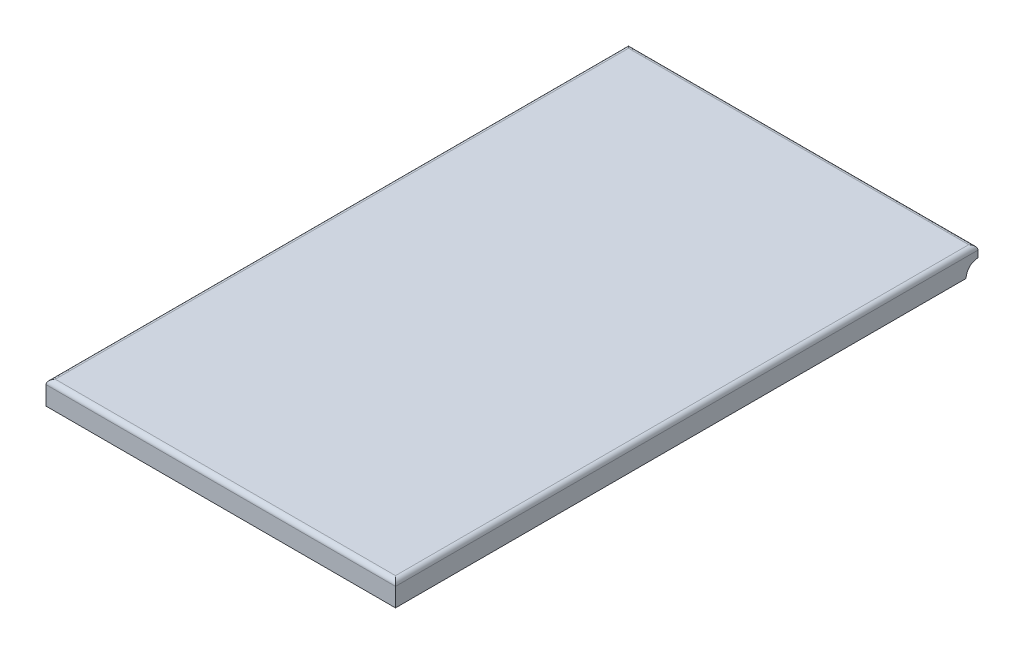
ISO-10303-21;
HEADER;
FILE_DESCRIPTION(('STEP AP214'),'2;1');
FILE_NAME('part.step','',(''),(''),'','','');
FILE_SCHEMA(('AUTOMOTIVE_DESIGN { 1 0 10303 214 1 1 1 1 }'));
ENDSEC;
DATA;
#1=APPLICATION_CONTEXT('core data for automotive mechanical design processes');
#2=APPLICATION_PROTOCOL_DEFINITION('international standard','automotive_design',2000,#1);
#3=PRODUCT_CONTEXT('',#1,'mechanical');
#4=PRODUCT('Part','Part','',(#3));
#5=PRODUCT_RELATED_PRODUCT_CATEGORY('part','',(#4));
#6=PRODUCT_DEFINITION_FORMATION('','',#4);
#7=PRODUCT_DEFINITION_CONTEXT('part definition',#1,'design');
#8=PRODUCT_DEFINITION('design','',#6,#7);
#9=PRODUCT_DEFINITION_SHAPE('','',#8);
#10=(LENGTH_UNIT() NAMED_UNIT(*) SI_UNIT(.MILLI.,.METRE.));
#11=(NAMED_UNIT(*) PLANE_ANGLE_UNIT() SI_UNIT($,.RADIAN.));
#12=(NAMED_UNIT(*) SI_UNIT($,.STERADIAN.) SOLID_ANGLE_UNIT());
#13=UNCERTAINTY_MEASURE_WITH_UNIT(LENGTH_MEASURE(1.E-05),#10,'distance_accuracy_value','');
#14=(GEOMETRIC_REPRESENTATION_CONTEXT(3) GLOBAL_UNCERTAINTY_ASSIGNED_CONTEXT((#13)) GLOBAL_UNIT_ASSIGNED_CONTEXT((#10,
#11,#12)) REPRESENTATION_CONTEXT('',''));
#15=CARTESIAN_POINT('',(0.,0.,0.));
#16=DIRECTION('',(0.,0.,1.));
#17=DIRECTION('',(1.,0.,0.));
#18=AXIS2_PLACEMENT_3D('',#15,#16,#17);
#19=CARTESIAN_POINT('',(0.,0.,250.));
#20=DIRECTION('',(0.,1.,0.));
#21=DIRECTION('',(0.,0.,1.));
#22=AXIS2_PLACEMENT_3D('',#19,#20,#21);
#23=PLANE('',#22);
#24=DIRECTION('',(1.,0.,0.));
#25=VECTOR('',#24,1.);
#26=CARTESIAN_POINT('',(0.,0.,5.1));
#27=LINE('',#26,#25);
#28=CARTESIAN_POINT('',(30.1,0.,5.1));
#29=VERTEX_POINT('',#28);
#30=CARTESIAN_POINT('',(0.,0.,5.1));
#31=VERTEX_POINT('',#30);
#32=EDGE_CURVE('E161',#29,#31,#27,.F.);
#33=ORIENTED_EDGE('',*,*,#32,.F.);
#34=DIRECTION('',(0.,0.,1.));
#35=VECTOR('',#34,1.);
#36=CARTESIAN_POINT('',(30.1,0.,250.));
#37=LINE('',#36,#35);
#38=CARTESIAN_POINT('',(30.1,0.,5.));
#39=VERTEX_POINT('',#38);
#40=EDGE_CURVE('E152',#39,#29,#37,.T.);
#41=ORIENTED_EDGE('',*,*,#40,.F.);
#42=DIRECTION('',(1.,0.,0.));
#43=VECTOR('',#42,1.);
#44=CARTESIAN_POINT('',(30.1,0.,5.));
#45=LINE('',#44,#43);
#46=CARTESIAN_POINT('',(59.95,0.,5.));
#47=VERTEX_POINT('',#46);
#48=EDGE_CURVE('E187',#39,#47,#45,.T.);
#49=ORIENTED_EDGE('',*,*,#48,.T.);
#50=DIRECTION('',(0.,0.,1.));
#51=VECTOR('',#50,1.);
#52=CARTESIAN_POINT('',(59.95,0.,250.));
#53=LINE('',#52,#51);
#54=CARTESIAN_POINT('',(59.95,0.,5.1));
#55=VERTEX_POINT('',#54);
#56=EDGE_CURVE('E204',#47,#55,#53,.T.);
#57=ORIENTED_EDGE('',*,*,#56,.T.);
#58=DIRECTION('',(1.,0.,0.));
#59=VECTOR('',#58,1.);
#60=CARTESIAN_POINT('',(59.95,0.,5.1));
#61=LINE('',#60,#59);
#62=CARTESIAN_POINT('',(90.05,0.,5.1));
#63=VERTEX_POINT('',#62);
#64=EDGE_CURVE('E207',#63,#55,#61,.F.);
#65=ORIENTED_EDGE('',*,*,#64,.F.);
#66=DIRECTION('',(0.,0.,1.));
#67=VECTOR('',#66,1.);
#68=CARTESIAN_POINT('',(90.05,0.,250.));
#69=LINE('',#68,#67);
#70=CARTESIAN_POINT('',(90.05,0.,5.));
#71=VERTEX_POINT('',#70);
#72=EDGE_CURVE('E201',#71,#63,#69,.T.);
#73=ORIENTED_EDGE('',*,*,#72,.F.);
#74=DIRECTION('',(1.,0.,0.));
#75=VECTOR('',#74,1.);
#76=CARTESIAN_POINT('',(90.05,0.,5.));
#77=LINE('',#76,#75);
#78=CARTESIAN_POINT('',(119.9,0.,5.));
#79=VERTEX_POINT('',#78);
#80=EDGE_CURVE('E223',#71,#79,#77,.T.);
#81=ORIENTED_EDGE('',*,*,#80,.T.);
#82=DIRECTION('',(0.,0.,-1.));
#83=VECTOR('',#82,1.);
#84=CARTESIAN_POINT('',(119.9,0.,250.));
#85=LINE('',#84,#83);
#86=CARTESIAN_POINT('',(119.9,0.,5.1));
#87=VERTEX_POINT('',#86);
#88=EDGE_CURVE('E231',#87,#79,#85,.T.);
#89=ORIENTED_EDGE('',*,*,#88,.F.);
#90=DIRECTION('',(1.,0.,0.));
#91=VECTOR('',#90,1.);
#92=CARTESIAN_POINT('',(119.9,0.,5.1));
#93=LINE('',#92,#91);
#94=CARTESIAN_POINT('',(150.,0.,5.1));
#95=VERTEX_POINT('',#94);
#96=EDGE_CURVE('E237',#87,#95,#93,.T.);
#97=ORIENTED_EDGE('',*,*,#96,.T.);
#98=DIRECTION('',(0.,0.,-1.));
#99=VECTOR('',#98,1.);
#100=CARTESIAN_POINT('',(150.,0.,250.));
#101=LINE('',#100,#99);
#102=CARTESIAN_POINT('',(150.,0.,250.));
#103=VERTEX_POINT('',#102);
#104=EDGE_CURVE('E253',#103,#95,#101,.T.);
#105=ORIENTED_EDGE('',*,*,#104,.F.);
#106=DIRECTION('',(1.,0.,0.));
#107=VECTOR('',#106,1.);
#108=CARTESIAN_POINT('',(0.,0.,250.));
#109=LINE('',#108,#107);
#110=CARTESIAN_POINT('',(0.,0.,250.));
#111=VERTEX_POINT('',#110);
#112=EDGE_CURVE('E245',#111,#103,#109,.T.);
#113=ORIENTED_EDGE('',*,*,#112,.F.);
#114=DIRECTION('',(0.,0.,-1.));
#115=VECTOR('',#114,1.);
#116=CARTESIAN_POINT('',(0.,0.,250.));
#117=LINE('',#116,#115);
#118=EDGE_CURVE('E175',#111,#31,#117,.T.);
#119=ORIENTED_EDGE('',*,*,#118,.T.);
#120=EDGE_LOOP('',(#33,#41,#49,#57,#65,#73,#81,#89,#97,#105,#113,#119));
#121=FACE_BOUND('',#120,.T.);
#122=ADVANCED_FACE('F45',(#121),#23,.F.);
#123=CARTESIAN_POINT('',(0.,0.,0.));
#124=DIRECTION('',(0.,0.,-1.));
#125=DIRECTION('',(-1.,0.,0.));
#126=AXIS2_PLACEMENT_3D('',#123,#124,#125);
#127=PLANE('',#126);
#128=DIRECTION('',(0.,1.,0.));
#129=VECTOR('',#128,1.);
#130=CARTESIAN_POINT('',(30.1,0.,0.));
#131=LINE('',#130,#129);
#132=CARTESIAN_POINT('',(30.1,5.,0.));
#133=VERTEX_POINT('',#132);
#134=CARTESIAN_POINT('',(30.1,5.1,0.));
#135=VERTEX_POINT('',#134);
#136=EDGE_CURVE('E162',#133,#135,#131,.T.);
#137=ORIENTED_EDGE('',*,*,#136,.T.);
#138=DIRECTION('',(1.,0.,0.));
#139=VECTOR('',#138,1.);
#140=CARTESIAN_POINT('',(0.,5.1,0.));
#141=LINE('',#140,#139);
#142=CARTESIAN_POINT('',(0.,5.1,0.));
#143=VERTEX_POINT('',#142);
#144=EDGE_CURVE('E11',#135,#143,#141,.F.);
#145=ORIENTED_EDGE('',*,*,#144,.T.);
#146=DIRECTION('',(0.,-1.,0.));
#147=VECTOR('',#146,1.);
#148=CARTESIAN_POINT('',(0.,0.,0.));
#149=LINE('',#148,#147);
#150=CARTESIAN_POINT('',(0.,8.,0.));
#151=VERTEX_POINT('',#150);
#152=EDGE_CURVE('E254',#151,#143,#149,.T.);
#153=ORIENTED_EDGE('',*,*,#152,.F.);
#154=DIRECTION('',(-1.,0.,0.));
#155=VECTOR('',#154,1.);
#156=CARTESIAN_POINT('',(150.,8.,0.));
#157=LINE('',#156,#155);
#158=CARTESIAN_POINT('',(150.,8.,0.));
#159=VERTEX_POINT('',#158);
#160=EDGE_CURVE('E279',#151,#159,#157,.F.);
#161=ORIENTED_EDGE('',*,*,#160,.T.);
#162=DIRECTION('',(0.,1.,0.));
#163=VECTOR('',#162,1.);
#164=CARTESIAN_POINT('',(150.,0.,0.));
#165=LINE('',#164,#163);
#166=CARTESIAN_POINT('',(150.,5.1,0.));
#167=VERTEX_POINT('',#166);
#168=EDGE_CURVE('E246',#167,#159,#165,.T.);
#169=ORIENTED_EDGE('',*,*,#168,.F.);
#170=DIRECTION('',(1.,0.,0.));
#171=VECTOR('',#170,1.);
#172=CARTESIAN_POINT('',(119.9,5.1,0.));
#173=LINE('',#172,#171);
#174=CARTESIAN_POINT('',(119.9,5.1,0.));
#175=VERTEX_POINT('',#174);
#176=EDGE_CURVE('E308',#175,#167,#173,.T.);
#177=ORIENTED_EDGE('',*,*,#176,.F.);
#178=DIRECTION('',(0.,-1.,0.));
#179=VECTOR('',#178,1.);
#180=CARTESIAN_POINT('',(119.9,0.,0.));
#181=LINE('',#180,#179);
#182=CARTESIAN_POINT('',(119.9,5.,0.));
#183=VERTEX_POINT('',#182);
#184=EDGE_CURVE('E292',#175,#183,#181,.T.);
#185=ORIENTED_EDGE('',*,*,#184,.T.);
#186=DIRECTION('',(1.,0.,0.));
#187=VECTOR('',#186,1.);
#188=CARTESIAN_POINT('',(90.05,5.,0.));
#189=LINE('',#188,#187);
#190=CARTESIAN_POINT('',(90.05,5.,0.));
#191=VERTEX_POINT('',#190);
#192=EDGE_CURVE('E216',#191,#183,#189,.T.);
#193=ORIENTED_EDGE('',*,*,#192,.F.);
#194=DIRECTION('',(0.,1.,0.));
#195=VECTOR('',#194,1.);
#196=CARTESIAN_POINT('',(90.05,0.,0.));
#197=LINE('',#196,#195);
#198=CARTESIAN_POINT('',(90.05,5.1,0.));
#199=VERTEX_POINT('',#198);
#200=EDGE_CURVE('E195',#191,#199,#197,.T.);
#201=ORIENTED_EDGE('',*,*,#200,.T.);
#202=DIRECTION('',(1.,0.,0.));
#203=VECTOR('',#202,1.);
#204=CARTESIAN_POINT('',(59.95,5.1,0.));
#205=LINE('',#204,#203);
#206=CARTESIAN_POINT('',(59.95,5.1,0.));
#207=VERTEX_POINT('',#206);
#208=EDGE_CURVE('E311',#199,#207,#205,.F.);
#209=ORIENTED_EDGE('',*,*,#208,.T.);
#210=DIRECTION('',(0.,1.,0.));
#211=VECTOR('',#210,1.);
#212=CARTESIAN_POINT('',(59.95,0.,0.));
#213=LINE('',#212,#211);
#214=CARTESIAN_POINT('',(59.95,5.,0.));
#215=VERTEX_POINT('',#214);
#216=EDGE_CURVE('E55',#215,#207,#213,.T.);
#217=ORIENTED_EDGE('',*,*,#216,.F.);
#218=DIRECTION('',(1.,0.,0.));
#219=VECTOR('',#218,1.);
#220=CARTESIAN_POINT('',(30.1,5.,0.));
#221=LINE('',#220,#219);
#222=EDGE_CURVE('E183',#133,#215,#221,.T.);
#223=ORIENTED_EDGE('',*,*,#222,.F.);
#224=EDGE_LOOP('',(#137,#145,#153,#161,#169,#177,#185,#193,#201,#209,#217,#223));
#225=FACE_BOUND('',#224,.T.);
#226=ADVANCED_FACE('F326',(#225),#127,.T.);
#227=CARTESIAN_POINT('',(0.,0.,250.));
#228=DIRECTION('',(1.,0.,0.));
#229=DIRECTION('',(0.,0.,-1.));
#230=AXIS2_PLACEMENT_3D('',#227,#228,#229);
#231=PLANE('',#230);
#232=CARTESIAN_POINT('',(0.,0.,0.));
#233=DIRECTION('',(-1.,0.,0.));
#234=DIRECTION('',(0.,0.,1.));
#235=AXIS2_PLACEMENT_3D('',#232,#233,#234);
#236=CIRCLE('',#235,5.1);
#237=EDGE_CURVE('E169',#31,#143,#236,.T.);
#238=ORIENTED_EDGE('',*,*,#237,.F.);
#239=ORIENTED_EDGE('',*,*,#118,.F.);
#240=DIRECTION('',(0.,-1.,0.));
#241=VECTOR('',#240,1.);
#242=CARTESIAN_POINT('',(0.,0.,250.));
#243=LINE('',#242,#241);
#244=CARTESIAN_POINT('',(0.,8.,250.));
#245=VERTEX_POINT('',#244);
#246=EDGE_CURVE('E242',#245,#111,#243,.T.);
#247=ORIENTED_EDGE('',*,*,#246,.F.);
#248=DIRECTION('',(0.,0.,-1.));
#249=VECTOR('',#248,1.);
#250=CARTESIAN_POINT('',(0.,8.,250.));
#251=LINE('',#250,#249);
#252=EDGE_CURVE('E283',#245,#151,#251,.T.);
#253=ORIENTED_EDGE('',*,*,#252,.T.);
#254=ORIENTED_EDGE('',*,*,#152,.T.);
#255=EDGE_LOOP('',(#238,#239,#247,#253,#254));
#256=FACE_BOUND('',#255,.T.);
#257=ADVANCED_FACE('F379',(#256),#231,.F.);
#258=CARTESIAN_POINT('',(150.,0.,250.));
#259=DIRECTION('',(-1.,0.,0.));
#260=DIRECTION('',(0.,0.,1.));
#261=AXIS2_PLACEMENT_3D('',#258,#259,#260);
#262=PLANE('',#261);
#263=ORIENTED_EDGE('',*,*,#104,.T.);
#264=CARTESIAN_POINT('',(150.,0.,0.));
#265=DIRECTION('',(1.,0.,0.));
#266=DIRECTION('',(0.,0.,-1.));
#267=AXIS2_PLACEMENT_3D('',#264,#265,#266);
#268=CIRCLE('',#267,5.1);
#269=EDGE_CURVE('E226',#167,#95,#268,.T.);
#270=ORIENTED_EDGE('',*,*,#269,.F.);
#271=ORIENTED_EDGE('',*,*,#168,.T.);
#272=DIRECTION('',(0.,0.,-1.));
#273=VECTOR('',#272,1.);
#274=CARTESIAN_POINT('',(150.,8.,250.));
#275=LINE('',#274,#273);
#276=CARTESIAN_POINT('',(150.,8.,250.));
#277=VERTEX_POINT('',#276);
#278=EDGE_CURVE('E286',#159,#277,#275,.F.);
#279=ORIENTED_EDGE('',*,*,#278,.T.);
#280=DIRECTION('',(0.,1.,0.));
#281=VECTOR('',#280,1.);
#282=CARTESIAN_POINT('',(150.,0.,250.));
#283=LINE('',#282,#281);
#284=EDGE_CURVE('E249',#103,#277,#283,.T.);
#285=ORIENTED_EDGE('',*,*,#284,.F.);
#286=EDGE_LOOP('',(#263,#270,#271,#279,#285));
#287=FACE_BOUND('',#286,.T.);
#288=ADVANCED_FACE('F383',(#287),#262,.F.);
#289=CARTESIAN_POINT('',(0.,10.,250.));
#290=DIRECTION('',(0.,-1.,0.));
#291=DIRECTION('',(0.,0.,-1.));
#292=AXIS2_PLACEMENT_3D('',#289,#290,#291);
#293=PLANE('',#292);
#294=DIRECTION('',(0.,0.,-1.));
#295=VECTOR('',#294,1.);
#296=CARTESIAN_POINT('',(148.,10.,250.));
#297=LINE('',#296,#295);
#298=CARTESIAN_POINT('',(148.,10.,248.));
#299=VERTEX_POINT('',#298);
#300=CARTESIAN_POINT('',(148.,10.,2.));
#301=VERTEX_POINT('',#300);
#302=EDGE_CURVE('E269',#299,#301,#297,.T.);
#303=ORIENTED_EDGE('',*,*,#302,.T.);
#304=DIRECTION('',(-1.,0.,0.));
#305=VECTOR('',#304,1.);
#306=CARTESIAN_POINT('',(0.,10.,2.));
#307=LINE('',#306,#305);
#308=CARTESIAN_POINT('',(2.,10.,2.));
#309=VERTEX_POINT('',#308);
#310=EDGE_CURVE('E275',#301,#309,#307,.T.);
#311=ORIENTED_EDGE('',*,*,#310,.T.);
#312=DIRECTION('',(0.,0.,-1.));
#313=VECTOR('',#312,1.);
#314=CARTESIAN_POINT('',(2.,10.,250.));
#315=LINE('',#314,#313);
#316=CARTESIAN_POINT('',(2.,10.,248.));
#317=VERTEX_POINT('',#316);
#318=EDGE_CURVE('E272',#309,#317,#315,.F.);
#319=ORIENTED_EDGE('',*,*,#318,.T.);
#320=DIRECTION('',(-1.,0.,0.));
#321=VECTOR('',#320,1.);
#322=CARTESIAN_POINT('',(0.,10.,248.));
#323=LINE('',#322,#321);
#324=EDGE_CURVE('E266',#317,#299,#323,.F.);
#325=ORIENTED_EDGE('',*,*,#324,.T.);
#326=EDGE_LOOP('',(#303,#311,#319,#325));
#327=FACE_BOUND('',#326,.T.);
#328=ADVANCED_FACE('F421',(#327),#293,.F.);
#329=CARTESIAN_POINT('',(0.,0.,250.));
#330=DIRECTION('',(0.,0.,-1.));
#331=DIRECTION('',(-1.,0.,0.));
#332=AXIS2_PLACEMENT_3D('',#329,#330,#331);
#333=PLANE('',#332);
#334=ORIENTED_EDGE('',*,*,#284,.T.);
#335=DIRECTION('',(-1.,0.,0.));
#336=VECTOR('',#335,1.);
#337=CARTESIAN_POINT('',(0.,8.,250.));
#338=LINE('',#337,#336);
#339=EDGE_CURVE('E289',#277,#245,#338,.T.);
#340=ORIENTED_EDGE('',*,*,#339,.T.);
#341=ORIENTED_EDGE('',*,*,#246,.T.);
#342=ORIENTED_EDGE('',*,*,#112,.T.);
#343=EDGE_LOOP('',(#334,#340,#341,#342));
#344=FACE_BOUND('',#343,.T.);
#345=ADVANCED_FACE('F402',(#344),#333,.F.);
#346=CARTESIAN_POINT('',(0.,8.,248.));
#347=DIRECTION('',(-1.,0.,0.));
#348=DIRECTION('',(0.,0.,1.));
#349=AXIS2_PLACEMENT_3D('',#346,#347,#348);
#350=CYLINDRICAL_SURFACE('',#349,2.);
#351=CARTESIAN_POINT('',(2.,8.,248.));
#352=DIRECTION('',(-0.707106781186547,0.,-0.707106781186547));
#353=DIRECTION('',(-0.707106781186547,0.,0.707106781186547));
#354=AXIS2_PLACEMENT_3D('',#351,#352,#353);
#355=ELLIPSE('',#354,2.82842712474619,2.);
#356=EDGE_CURVE('E299',#245,#317,#355,.T.);
#357=ORIENTED_EDGE('',*,*,#356,.F.);
#358=ORIENTED_EDGE('',*,*,#339,.F.);
#359=CARTESIAN_POINT('',(148.,8.,248.));
#360=DIRECTION('',(-0.707106781186547,0.,0.707106781186547));
#361=DIRECTION('',(-0.707106781186547,0.,-0.707106781186547));
#362=AXIS2_PLACEMENT_3D('',#359,#360,#361);
#363=ELLIPSE('',#362,2.82842712474619,2.);
#364=EDGE_CURVE('E258',#299,#277,#363,.F.);
#365=ORIENTED_EDGE('',*,*,#364,.F.);
#366=ORIENTED_EDGE('',*,*,#324,.F.);
#367=EDGE_LOOP('',(#357,#358,#365,#366));
#368=FACE_BOUND('',#367,.T.);
#369=ADVANCED_FACE('F47',(#368),#350,.T.);
#370=CARTESIAN_POINT('',(148.,8.,250.));
#371=DIRECTION('',(0.,0.,-1.));
#372=DIRECTION('',(-1.,0.,0.));
#373=AXIS2_PLACEMENT_3D('',#370,#371,#372);
#374=CYLINDRICAL_SURFACE('',#373,2.);
#375=ORIENTED_EDGE('',*,*,#364,.T.);
#376=ORIENTED_EDGE('',*,*,#278,.F.);
#377=CARTESIAN_POINT('',(148.,8.,2.));
#378=DIRECTION('',(-0.707106781186547,0.,-0.707106781186547));
#379=DIRECTION('',(0.707106781186547,0.,-0.707106781186547));
#380=AXIS2_PLACEMENT_3D('',#377,#378,#379);
#381=ELLIPSE('',#380,2.82842712474619,2.);
#382=EDGE_CURVE('E295',#301,#159,#381,.T.);
#383=ORIENTED_EDGE('',*,*,#382,.F.);
#384=ORIENTED_EDGE('',*,*,#302,.F.);
#385=EDGE_LOOP('',(#375,#376,#383,#384));
#386=FACE_BOUND('',#385,.T.);
#387=ADVANCED_FACE('F395',(#386),#374,.T.);
#388=CARTESIAN_POINT('',(2.,8.,250.));
#389=DIRECTION('',(0.,0.,-1.));
#390=DIRECTION('',(-1.,0.,0.));
#391=AXIS2_PLACEMENT_3D('',#388,#389,#390);
#392=CYLINDRICAL_SURFACE('',#391,2.);
#393=ORIENTED_EDGE('',*,*,#356,.T.);
#394=ORIENTED_EDGE('',*,*,#318,.F.);
#395=CARTESIAN_POINT('',(2.,8.,2.));
#396=DIRECTION('',(0.707106781186547,0.,-0.707106781186547));
#397=DIRECTION('',(-0.707106781186547,0.,-0.707106781186547));
#398=AXIS2_PLACEMENT_3D('',#395,#396,#397);
#399=ELLIPSE('',#398,2.82842712474619,2.);
#400=EDGE_CURVE('E241',#151,#309,#399,.T.);
#401=ORIENTED_EDGE('',*,*,#400,.F.);
#402=ORIENTED_EDGE('',*,*,#252,.F.);
#403=EDGE_LOOP('',(#393,#394,#401,#402));
#404=FACE_BOUND('',#403,.T.);
#405=ADVANCED_FACE('F392',(#404),#392,.T.);
#406=CARTESIAN_POINT('',(0.,8.,2.));
#407=DIRECTION('',(1.,0.,0.));
#408=DIRECTION('',(0.,0.,-1.));
#409=AXIS2_PLACEMENT_3D('',#406,#407,#408);
#410=CYLINDRICAL_SURFACE('',#409,2.);
#411=ORIENTED_EDGE('',*,*,#382,.T.);
#412=ORIENTED_EDGE('',*,*,#160,.F.);
#413=ORIENTED_EDGE('',*,*,#400,.T.);
#414=ORIENTED_EDGE('',*,*,#310,.F.);
#415=EDGE_LOOP('',(#411,#412,#413,#414));
#416=FACE_BOUND('',#415,.T.);
#417=ADVANCED_FACE('F388',(#416),#410,.T.);
#418=CARTESIAN_POINT('',(119.9,0.,0.));
#419=DIRECTION('',(1.,0.,0.));
#420=DIRECTION('',(0.,0.,-1.));
#421=AXIS2_PLACEMENT_3D('',#418,#419,#420);
#422=CYLINDRICAL_SURFACE('',#421,5.1);
#423=CARTESIAN_POINT('',(119.9,0.,0.));
#424=DIRECTION('',(1.,0.,0.));
#425=DIRECTION('',(0.,0.,-1.));
#426=AXIS2_PLACEMENT_3D('',#423,#424,#425);
#427=CIRCLE('',#426,5.1);
#428=EDGE_CURVE('E227',#175,#87,#427,.T.);
#429=ORIENTED_EDGE('',*,*,#428,.F.);
#430=ORIENTED_EDGE('',*,*,#176,.T.);
#431=ORIENTED_EDGE('',*,*,#269,.T.);
#432=ORIENTED_EDGE('',*,*,#96,.F.);
#433=EDGE_LOOP('',(#429,#430,#431,#432));
#434=FACE_BOUND('',#433,.T.);
#435=ADVANCED_FACE('F391',(#434),#422,.F.);
#436=CARTESIAN_POINT('',(119.9,0.,0.));
#437=DIRECTION('',(1.,0.,0.));
#438=DIRECTION('',(0.,0.,-1.));
#439=AXIS2_PLACEMENT_3D('',#436,#437,#438);
#440=PLANE('',#439);
#441=CARTESIAN_POINT('',(119.9,0.,0.));
#442=DIRECTION('',(1.,0.,0.));
#443=DIRECTION('',(0.,0.,-1.));
#444=AXIS2_PLACEMENT_3D('',#441,#442,#443);
#445=CIRCLE('',#444,0.875);
#446=CARTESIAN_POINT('',(119.9,0.,-0.875));
#447=VERTEX_POINT('',#446);
#448=EDGE_CURVE('E346',#447,#447,#445,.T.);
#449=ORIENTED_EDGE('',*,*,#448,.F.);
#450=EDGE_LOOP('',(#449));
#451=FACE_BOUND('',#450,.T.);
#452=ORIENTED_EDGE('',*,*,#88,.T.);
#453=CARTESIAN_POINT('',(119.9,0.,0.));
#454=DIRECTION('',(1.,0.,0.));
#455=DIRECTION('',(0.,0.,-1.));
#456=AXIS2_PLACEMENT_3D('',#453,#454,#455);
#457=CIRCLE('',#456,5.);
#458=EDGE_CURVE('E211',#79,#183,#457,.T.);
#459=ORIENTED_EDGE('',*,*,#458,.T.);
#460=ORIENTED_EDGE('',*,*,#184,.F.);
#461=ORIENTED_EDGE('',*,*,#428,.T.);
#462=EDGE_LOOP('',(#452,#459,#460,#461));
#463=FACE_BOUND('',#462,.T.);
#464=ADVANCED_FACE('F432',(#451,#463),#440,.T.);
#465=CARTESIAN_POINT('',(90.05,0.,0.));
#466=DIRECTION('',(1.,0.,0.));
#467=DIRECTION('',(0.,0.,-1.));
#468=AXIS2_PLACEMENT_3D('',#465,#466,#467);
#469=PLANE('',#468);
#470=CARTESIAN_POINT('',(90.05,0.,0.));
#471=DIRECTION('',(1.,0.,0.));
#472=DIRECTION('',(0.,0.,-1.));
#473=AXIS2_PLACEMENT_3D('',#470,#471,#472);
#474=CIRCLE('',#473,0.875);
#475=CARTESIAN_POINT('',(90.05,0.,-0.875));
#476=VERTEX_POINT('',#475);
#477=EDGE_CURVE('E170',#476,#476,#474,.T.);
#478=ORIENTED_EDGE('',*,*,#477,.T.);
#479=EDGE_LOOP('',(#478));
#480=FACE_BOUND('',#479,.T.);
#481=CARTESIAN_POINT('',(90.05,0.,0.));
#482=DIRECTION('',(1.,0.,0.));
#483=DIRECTION('',(0.,0.,-1.));
#484=AXIS2_PLACEMENT_3D('',#481,#482,#483);
#485=CIRCLE('',#484,5.);
#486=EDGE_CURVE('E212',#71,#191,#485,.T.);
#487=ORIENTED_EDGE('',*,*,#486,.F.);
#488=ORIENTED_EDGE('',*,*,#72,.T.);
#489=CARTESIAN_POINT('',(90.05,0.,0.));
#490=DIRECTION('',(-1.,0.,0.));
#491=DIRECTION('',(0.,0.,1.));
#492=AXIS2_PLACEMENT_3D('',#489,#490,#491);
#493=CIRCLE('',#492,5.1);
#494=EDGE_CURVE('E190',#63,#199,#493,.T.);
#495=ORIENTED_EDGE('',*,*,#494,.T.);
#496=ORIENTED_EDGE('',*,*,#200,.F.);
#497=EDGE_LOOP('',(#487,#488,#495,#496));
#498=FACE_BOUND('',#497,.T.);
#499=ADVANCED_FACE('F330',(#480,#498),#469,.F.);
#500=CARTESIAN_POINT('',(90.05,0.,0.));
#501=DIRECTION('',(1.,0.,0.));
#502=DIRECTION('',(0.,0.,-1.));
#503=AXIS2_PLACEMENT_3D('',#500,#501,#502);
#504=CYLINDRICAL_SURFACE('',#503,5.);
#505=ORIENTED_EDGE('',*,*,#80,.F.);
#506=ORIENTED_EDGE('',*,*,#486,.T.);
#507=ORIENTED_EDGE('',*,*,#192,.T.);
#508=ORIENTED_EDGE('',*,*,#458,.F.);
#509=EDGE_LOOP('',(#505,#506,#507,#508));
#510=FACE_BOUND('',#509,.T.);
#511=ADVANCED_FACE('F371',(#510),#504,.T.);
#512=CARTESIAN_POINT('',(59.95,0.,0.));
#513=DIRECTION('',(1.,0.,0.));
#514=DIRECTION('',(0.,0.,-1.));
#515=AXIS2_PLACEMENT_3D('',#512,#513,#514);
#516=CYLINDRICAL_SURFACE('',#515,5.1);
#517=ORIENTED_EDGE('',*,*,#64,.T.);
#518=CARTESIAN_POINT('',(59.95,0.,0.));
#519=DIRECTION('',(-1.,0.,0.));
#520=DIRECTION('',(0.,0.,1.));
#521=AXIS2_PLACEMENT_3D('',#518,#519,#520);
#522=CIRCLE('',#521,5.1);
#523=EDGE_CURVE('E191',#55,#207,#522,.T.);
#524=ORIENTED_EDGE('',*,*,#523,.T.);
#525=ORIENTED_EDGE('',*,*,#208,.F.);
#526=ORIENTED_EDGE('',*,*,#494,.F.);
#527=EDGE_LOOP('',(#517,#524,#525,#526));
#528=FACE_BOUND('',#527,.T.);
#529=ADVANCED_FACE('F323',(#528),#516,.F.);
#530=CARTESIAN_POINT('',(59.95,0.,0.));
#531=DIRECTION('',(-1.,0.,0.));
#532=DIRECTION('',(0.,0.,1.));
#533=AXIS2_PLACEMENT_3D('',#530,#531,#532);
#534=PLANE('',#533);
#535=CARTESIAN_POINT('',(59.95,0.,0.));
#536=DIRECTION('',(-1.,0.,0.));
#537=DIRECTION('',(0.,0.,1.));
#538=AXIS2_PLACEMENT_3D('',#535,#536,#537);
#539=CIRCLE('',#538,0.875);
#540=CARTESIAN_POINT('',(59.95,0.,0.875));
#541=VERTEX_POINT('',#540);
#542=EDGE_CURVE('E342',#541,#541,#539,.T.);
#543=ORIENTED_EDGE('',*,*,#542,.T.);
#544=EDGE_LOOP('',(#543));
#545=FACE_BOUND('',#544,.T.);
#546=ORIENTED_EDGE('',*,*,#56,.F.);
#547=CARTESIAN_POINT('',(59.95,0.,0.));
#548=DIRECTION('',(1.,0.,0.));
#549=DIRECTION('',(0.,0.,-1.));
#550=AXIS2_PLACEMENT_3D('',#547,#548,#549);
#551=CIRCLE('',#550,5.);
#552=EDGE_CURVE('E70',#47,#215,#551,.T.);
#553=ORIENTED_EDGE('',*,*,#552,.T.);
#554=ORIENTED_EDGE('',*,*,#216,.T.);
#555=ORIENTED_EDGE('',*,*,#523,.F.);
#556=EDGE_LOOP('',(#546,#553,#554,#555));
#557=FACE_BOUND('',#556,.T.);
#558=ADVANCED_FACE('F318',(#545,#557),#534,.F.);
#559=CARTESIAN_POINT('',(30.1,0.,0.));
#560=DIRECTION('',(1.,0.,0.));
#561=DIRECTION('',(0.,0.,-1.));
#562=AXIS2_PLACEMENT_3D('',#559,#560,#561);
#563=PLANE('',#562);
#564=CARTESIAN_POINT('',(30.1,0.,0.));
#565=DIRECTION('',(1.,0.,0.));
#566=DIRECTION('',(0.,0.,-1.));
#567=AXIS2_PLACEMENT_3D('',#564,#565,#566);
#568=CIRCLE('',#567,0.875);
#569=CARTESIAN_POINT('',(30.1,0.,-0.875));
#570=VERTEX_POINT('',#569);
#571=EDGE_CURVE('E49',#570,#570,#568,.T.);
#572=ORIENTED_EDGE('',*,*,#571,.T.);
#573=EDGE_LOOP('',(#572));
#574=FACE_BOUND('',#573,.T.);
#575=CARTESIAN_POINT('',(30.1,0.,0.));
#576=DIRECTION('',(1.,0.,0.));
#577=DIRECTION('',(0.,0.,-1.));
#578=AXIS2_PLACEMENT_3D('',#575,#576,#577);
#579=CIRCLE('',#578,5.);
#580=EDGE_CURVE('E155',#39,#133,#579,.T.);
#581=ORIENTED_EDGE('',*,*,#580,.F.);
#582=ORIENTED_EDGE('',*,*,#40,.T.);
#583=CARTESIAN_POINT('',(30.1,0.,0.));
#584=DIRECTION('',(-1.,0.,0.));
#585=DIRECTION('',(0.,0.,1.));
#586=AXIS2_PLACEMENT_3D('',#583,#584,#585);
#587=CIRCLE('',#586,5.1);
#588=EDGE_CURVE('E62',#29,#135,#587,.T.);
#589=ORIENTED_EDGE('',*,*,#588,.T.);
#590=ORIENTED_EDGE('',*,*,#136,.F.);
#591=EDGE_LOOP('',(#581,#582,#589,#590));
#592=FACE_BOUND('',#591,.T.);
#593=ADVANCED_FACE('F153',(#574,#592),#563,.F.);
#594=CARTESIAN_POINT('',(30.1,0.,0.));
#595=DIRECTION('',(1.,0.,0.));
#596=DIRECTION('',(0.,0.,-1.));
#597=AXIS2_PLACEMENT_3D('',#594,#595,#596);
#598=CYLINDRICAL_SURFACE('',#597,5.);
#599=ORIENTED_EDGE('',*,*,#48,.F.);
#600=ORIENTED_EDGE('',*,*,#580,.T.);
#601=ORIENTED_EDGE('',*,*,#222,.T.);
#602=ORIENTED_EDGE('',*,*,#552,.F.);
#603=EDGE_LOOP('',(#599,#600,#601,#602));
#604=FACE_BOUND('',#603,.T.);
#605=ADVANCED_FACE('F333',(#604),#598,.T.);
#606=CARTESIAN_POINT('',(0.,0.,0.));
#607=DIRECTION('',(1.,0.,0.));
#608=DIRECTION('',(0.,0.,-1.));
#609=AXIS2_PLACEMENT_3D('',#606,#607,#608);
#610=CYLINDRICAL_SURFACE('',#609,5.1);
#611=ORIENTED_EDGE('',*,*,#32,.T.);
#612=ORIENTED_EDGE('',*,*,#237,.T.);
#613=ORIENTED_EDGE('',*,*,#144,.F.);
#614=ORIENTED_EDGE('',*,*,#588,.F.);
#615=EDGE_LOOP('',(#611,#612,#613,#614));
#616=FACE_BOUND('',#615,.T.);
#617=ADVANCED_FACE('F165',(#616),#610,.F.);
#618=CARTESIAN_POINT('',(29.8,0.,0.));
#619=DIRECTION('',(1.,0.,0.));
#620=DIRECTION('',(0.,0.,-1.));
#621=AXIS2_PLACEMENT_3D('',#618,#619,#620);
#622=CYLINDRICAL_SURFACE('',#621,0.875);
#623=ORIENTED_EDGE('',*,*,#571,.F.);
#624=EDGE_LOOP('',(#623));
#625=FACE_BOUND('',#624,.T.);
#626=ORIENTED_EDGE('',*,*,#542,.F.);
#627=EDGE_LOOP('',(#626));
#628=FACE_BOUND('',#627,.T.);
#629=ADVANCED_FACE('F356',(#625,#628),#622,.F.);
#630=ORIENTED_EDGE('',*,*,#448,.T.);
#631=EDGE_LOOP('',(#630));
#632=FACE_BOUND('',#631,.T.);
#633=ORIENTED_EDGE('',*,*,#477,.F.);
#634=EDGE_LOOP('',(#633));
#635=FACE_BOUND('',#634,.T.);
#636=ADVANCED_FACE('F359',(#632,#635),#622,.F.);
#637=CLOSED_SHELL('',(#122,#226,#257,#288,#328,#345,#369,#387,#405,#417,#435,#464,#499,#511,
#529,#558,#593,#605,#617,#629,#636));
#638=MANIFOLD_SOLID_BREP('B2',#637);
#639=ADVANCED_BREP_SHAPE_REPRESENTATION('',(#18,#638),#14);
#640=SHAPE_DEFINITION_REPRESENTATION(#9,#639);
ENDSEC;
END-ISO-10303-21;
